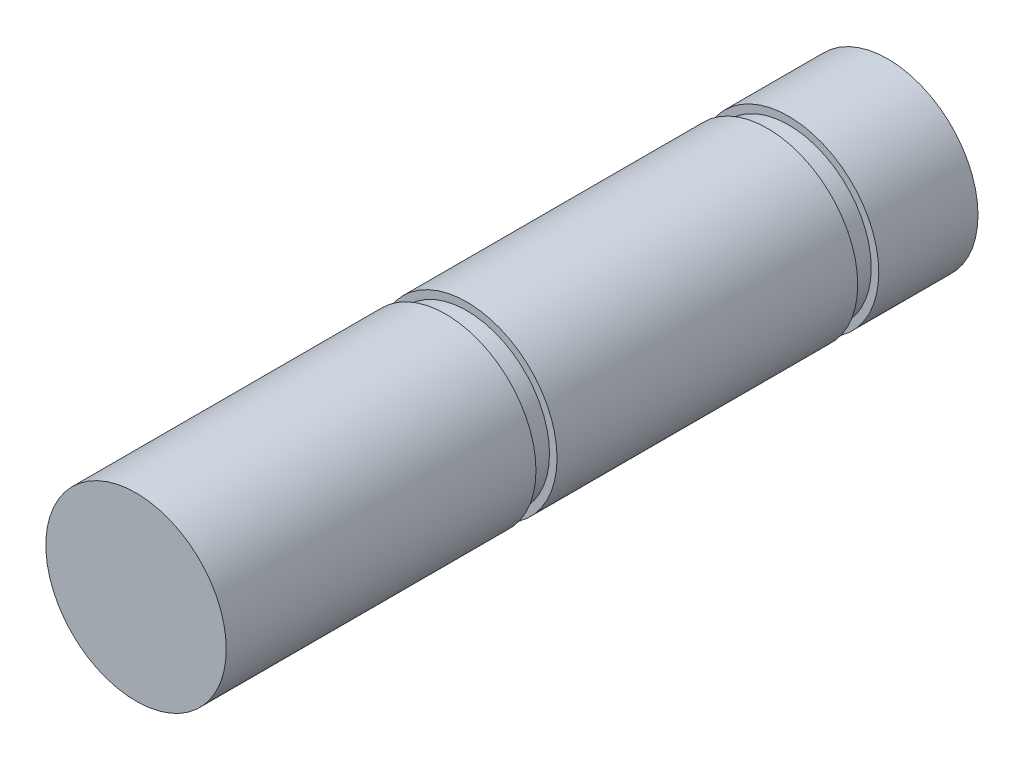
ISO-10303-21;
HEADER;
FILE_DESCRIPTION(('STEP AP214'),'2;1');
FILE_NAME('part.step','',(''),(''),'','','');
FILE_SCHEMA(('AUTOMOTIVE_DESIGN { 1 0 10303 214 1 1 1 1 }'));
ENDSEC;
DATA;
#1=APPLICATION_CONTEXT('core data for automotive mechanical design processes');
#2=APPLICATION_PROTOCOL_DEFINITION('international standard','automotive_design',2000,#1);
#3=PRODUCT_CONTEXT('',#1,'mechanical');
#4=PRODUCT('Part','Part','',(#3));
#5=PRODUCT_RELATED_PRODUCT_CATEGORY('part','',(#4));
#6=PRODUCT_DEFINITION_FORMATION('','',#4);
#7=PRODUCT_DEFINITION_CONTEXT('part definition',#1,'design');
#8=PRODUCT_DEFINITION('design','',#6,#7);
#9=PRODUCT_DEFINITION_SHAPE('','',#8);
#10=(LENGTH_UNIT() NAMED_UNIT(*) SI_UNIT(.MILLI.,.METRE.));
#11=(NAMED_UNIT(*) PLANE_ANGLE_UNIT() SI_UNIT($,.RADIAN.));
#12=(NAMED_UNIT(*) SI_UNIT($,.STERADIAN.) SOLID_ANGLE_UNIT());
#13=UNCERTAINTY_MEASURE_WITH_UNIT(LENGTH_MEASURE(1.E-05),#10,'distance_accuracy_value','');
#14=(GEOMETRIC_REPRESENTATION_CONTEXT(3) GLOBAL_UNCERTAINTY_ASSIGNED_CONTEXT((#13)) GLOBAL_UNIT_ASSIGNED_CONTEXT((#10,
#11,#12)) REPRESENTATION_CONTEXT('',''));
#15=CARTESIAN_POINT('',(0.,0.,0.));
#16=DIRECTION('',(0.,0.,1.));
#17=DIRECTION('',(1.,0.,0.));
#18=AXIS2_PLACEMENT_3D('',#15,#16,#17);
#19=CARTESIAN_POINT('',(0.,0.,25.));
#20=DIRECTION('',(0.,0.,-1.));
#21=DIRECTION('',(-1.,0.,0.));
#22=AXIS2_PLACEMENT_3D('',#19,#20,#21);
#23=CYLINDRICAL_SURFACE('',#22,3.);
#24=CARTESIAN_POINT('',(0.,0.,4.));
#25=DIRECTION('',(0.,0.,1.));
#26=DIRECTION('',(1.,0.,0.));
#27=AXIS2_PLACEMENT_3D('',#24,#25,#26);
#28=CIRCLE('',#27,3.);
#29=CARTESIAN_POINT('',(3.,0.,4.));
#30=VERTEX_POINT('',#29);
#31=EDGE_CURVE('E49',#30,#30,#28,.T.);
#32=ORIENTED_EDGE('',*,*,#31,.T.);
#33=EDGE_LOOP('',(#32));
#34=FACE_BOUND('',#33,.T.);
#35=CARTESIAN_POINT('',(0.,0.,14.));
#36=DIRECTION('',(0.,0.,1.));
#37=DIRECTION('',(1.,0.,0.));
#38=AXIS2_PLACEMENT_3D('',#35,#36,#37);
#39=CIRCLE('',#38,3.);
#40=CARTESIAN_POINT('',(3.,0.,14.));
#41=VERTEX_POINT('',#40);
#42=EDGE_CURVE('E66',#41,#41,#39,.T.);
#43=ORIENTED_EDGE('',*,*,#42,.F.);
#44=EDGE_LOOP('',(#43));
#45=FACE_BOUND('',#44,.T.);
#46=ADVANCED_FACE('F36',(#34,#45),#23,.T.);
#47=CARTESIAN_POINT('',(0.,0.,4.));
#48=DIRECTION('',(0.,0.,1.));
#49=DIRECTION('',(1.,0.,0.));
#50=AXIS2_PLACEMENT_3D('',#47,#48,#49);
#51=PLANE('',#50);
#52=ORIENTED_EDGE('',*,*,#31,.F.);
#53=EDGE_LOOP('',(#52));
#54=FACE_BOUND('',#53,.T.);
#55=CARTESIAN_POINT('',(0.,0.,4.));
#56=DIRECTION('',(0.,0.,1.));
#57=DIRECTION('',(1.,0.,0.));
#58=AXIS2_PLACEMENT_3D('',#55,#56,#57);
#59=CIRCLE('',#58,2.75);
#60=CARTESIAN_POINT('',(2.75,0.,4.));
#61=VERTEX_POINT('',#60);
#62=EDGE_CURVE('E54',#61,#61,#59,.T.);
#63=ORIENTED_EDGE('',*,*,#62,.T.);
#64=EDGE_LOOP('',(#63));
#65=FACE_BOUND('',#64,.T.);
#66=ADVANCED_FACE('F94',(#54,#65),#51,.F.);
#67=CARTESIAN_POINT('',(0.,0.,4.));
#68=DIRECTION('',(0.,0.,-1.));
#69=DIRECTION('',(-1.,0.,0.));
#70=AXIS2_PLACEMENT_3D('',#67,#68,#69);
#71=CYLINDRICAL_SURFACE('',#70,2.75);
#72=ORIENTED_EDGE('',*,*,#62,.F.);
#73=EDGE_LOOP('',(#72));
#74=FACE_BOUND('',#73,.T.);
#75=CARTESIAN_POINT('',(0.,0.,3.3));
#76=DIRECTION('',(0.,0.,1.));
#77=DIRECTION('',(1.,0.,0.));
#78=AXIS2_PLACEMENT_3D('',#75,#76,#77);
#79=CIRCLE('',#78,2.75);
#80=CARTESIAN_POINT('',(2.75,0.,3.3));
#81=VERTEX_POINT('',#80);
#82=EDGE_CURVE('E62',#81,#81,#79,.T.);
#83=ORIENTED_EDGE('',*,*,#82,.T.);
#84=EDGE_LOOP('',(#83));
#85=FACE_BOUND('',#84,.T.);
#86=ADVANCED_FACE('F102',(#74,#85),#71,.T.);
#87=CARTESIAN_POINT('',(0.,0.,3.3));
#88=DIRECTION('',(0.,0.,1.));
#89=DIRECTION('',(1.,0.,0.));
#90=AXIS2_PLACEMENT_3D('',#87,#88,#89);
#91=PLANE('',#90);
#92=ORIENTED_EDGE('',*,*,#82,.F.);
#93=EDGE_LOOP('',(#92));
#94=FACE_BOUND('',#93,.T.);
#95=CARTESIAN_POINT('',(0.,0.,3.3));
#96=DIRECTION('',(0.,0.,1.));
#97=DIRECTION('',(1.,0.,0.));
#98=AXIS2_PLACEMENT_3D('',#95,#96,#97);
#99=CIRCLE('',#98,3.);
#100=CARTESIAN_POINT('',(3.,0.,3.3));
#101=VERTEX_POINT('',#100);
#102=EDGE_CURVE('E58',#101,#101,#99,.T.);
#103=ORIENTED_EDGE('',*,*,#102,.T.);
#104=EDGE_LOOP('',(#103));
#105=FACE_BOUND('',#104,.T.);
#106=ADVANCED_FACE('F125',(#94,#105),#91,.T.);
#107=CARTESIAN_POINT('',(0.,0.,0.));
#108=DIRECTION('',(0.,0.,1.));
#109=DIRECTION('',(1.,0.,0.));
#110=AXIS2_PLACEMENT_3D('',#107,#108,#109);
#111=PLANE('',#110);
#112=CARTESIAN_POINT('',(0.,0.,0.));
#113=DIRECTION('',(0.,0.,1.));
#114=DIRECTION('',(1.,0.,0.));
#115=AXIS2_PLACEMENT_3D('',#112,#113,#114);
#116=CIRCLE('',#115,3.);
#117=CARTESIAN_POINT('',(3.,0.,0.));
#118=VERTEX_POINT('',#117);
#119=EDGE_CURVE('E40',#118,#118,#116,.T.);
#120=ORIENTED_EDGE('',*,*,#119,.F.);
#121=EDGE_LOOP('',(#120));
#122=FACE_BOUND('',#121,.T.);
#123=ADVANCED_FACE('F105',(#122),#111,.F.);
#124=ORIENTED_EDGE('',*,*,#119,.T.);
#125=EDGE_LOOP('',(#124));
#126=FACE_BOUND('',#125,.T.);
#127=ORIENTED_EDGE('',*,*,#102,.F.);
#128=EDGE_LOOP('',(#127));
#129=FACE_BOUND('',#128,.T.);
#130=ADVANCED_FACE('F96',(#126,#129),#23,.T.);
#131=CARTESIAN_POINT('',(0.,0.,14.));
#132=DIRECTION('',(0.,0.,1.));
#133=DIRECTION('',(1.,0.,0.));
#134=AXIS2_PLACEMENT_3D('',#131,#132,#133);
#135=CYLINDRICAL_SURFACE('',#134,2.75);
#136=CARTESIAN_POINT('',(0.,0.,14.));
#137=DIRECTION('',(0.,0.,1.));
#138=DIRECTION('',(1.,0.,0.));
#139=AXIS2_PLACEMENT_3D('',#136,#137,#138);
#140=CIRCLE('',#139,2.75);
#141=CARTESIAN_POINT('',(2.75,0.,14.));
#142=VERTEX_POINT('',#141);
#143=EDGE_CURVE('E71',#142,#142,#140,.T.);
#144=ORIENTED_EDGE('',*,*,#143,.T.);
#145=EDGE_LOOP('',(#144));
#146=FACE_BOUND('',#145,.T.);
#147=CARTESIAN_POINT('',(0.,0.,14.7));
#148=DIRECTION('',(0.,0.,1.));
#149=DIRECTION('',(1.,0.,0.));
#150=AXIS2_PLACEMENT_3D('',#147,#148,#149);
#151=CIRCLE('',#150,2.75);
#152=CARTESIAN_POINT('',(2.75,0.,14.7));
#153=VERTEX_POINT('',#152);
#154=EDGE_CURVE('E72',#153,#153,#151,.T.);
#155=ORIENTED_EDGE('',*,*,#154,.F.);
#156=EDGE_LOOP('',(#155));
#157=FACE_BOUND('',#156,.T.);
#158=ADVANCED_FACE('F83',(#146,#157),#135,.T.);
#159=CARTESIAN_POINT('',(0.,0.,14.));
#160=DIRECTION('',(0.,0.,1.));
#161=DIRECTION('',(1.,0.,0.));
#162=AXIS2_PLACEMENT_3D('',#159,#160,#161);
#163=PLANE('',#162);
#164=ORIENTED_EDGE('',*,*,#143,.F.);
#165=EDGE_LOOP('',(#164));
#166=FACE_BOUND('',#165,.T.);
#167=ORIENTED_EDGE('',*,*,#42,.T.);
#168=EDGE_LOOP('',(#167));
#169=FACE_BOUND('',#168,.T.);
#170=ADVANCED_FACE('F86',(#166,#169),#163,.T.);
#171=CARTESIAN_POINT('',(0.,0.,14.7));
#172=DIRECTION('',(0.,0.,1.));
#173=DIRECTION('',(1.,0.,0.));
#174=AXIS2_PLACEMENT_3D('',#171,#172,#173);
#175=PLANE('',#174);
#176=ORIENTED_EDGE('',*,*,#154,.T.);
#177=EDGE_LOOP('',(#176));
#178=FACE_BOUND('',#177,.T.);
#179=CARTESIAN_POINT('',(0.,0.,14.7));
#180=DIRECTION('',(0.,0.,1.));
#181=DIRECTION('',(1.,0.,0.));
#182=AXIS2_PLACEMENT_3D('',#179,#180,#181);
#183=CIRCLE('',#182,3.);
#184=CARTESIAN_POINT('',(3.,0.,14.7));
#185=VERTEX_POINT('',#184);
#186=EDGE_CURVE('E67',#185,#185,#183,.T.);
#187=ORIENTED_EDGE('',*,*,#186,.F.);
#188=EDGE_LOOP('',(#187));
#189=FACE_BOUND('',#188,.T.);
#190=ADVANCED_FACE('F89',(#178,#189),#175,.F.);
#191=CARTESIAN_POINT('',(0.,0.,25.));
#192=DIRECTION('',(0.,0.,1.));
#193=DIRECTION('',(1.,0.,0.));
#194=AXIS2_PLACEMENT_3D('',#191,#192,#193);
#195=PLANE('',#194);
#196=CARTESIAN_POINT('',(0.,0.,25.));
#197=DIRECTION('',(0.,0.,1.));
#198=DIRECTION('',(1.,0.,0.));
#199=AXIS2_PLACEMENT_3D('',#196,#197,#198);
#200=CIRCLE('',#199,3.);
#201=CARTESIAN_POINT('',(3.,0.,25.));
#202=VERTEX_POINT('',#201);
#203=EDGE_CURVE('E10',#202,#202,#200,.T.);
#204=ORIENTED_EDGE('',*,*,#203,.T.);
#205=EDGE_LOOP('',(#204));
#206=FACE_BOUND('',#205,.T.);
#207=ADVANCED_FACE('F108',(#206),#195,.T.);
#208=ORIENTED_EDGE('',*,*,#186,.T.);
#209=EDGE_LOOP('',(#208));
#210=FACE_BOUND('',#209,.T.);
#211=ORIENTED_EDGE('',*,*,#203,.F.);
#212=EDGE_LOOP('',(#211));
#213=FACE_BOUND('',#212,.T.);
#214=ADVANCED_FACE('F38',(#210,#213),#23,.T.);
#215=CLOSED_SHELL('',(#46,#66,#86,#106,#123,#130,#158,#170,#190,#207,#214));
#216=MANIFOLD_SOLID_BREP('B2',#215);
#217=ADVANCED_BREP_SHAPE_REPRESENTATION('',(#18,#216),#14);
#218=SHAPE_DEFINITION_REPRESENTATION(#9,#217);
ENDSEC;
END-ISO-10303-21;
